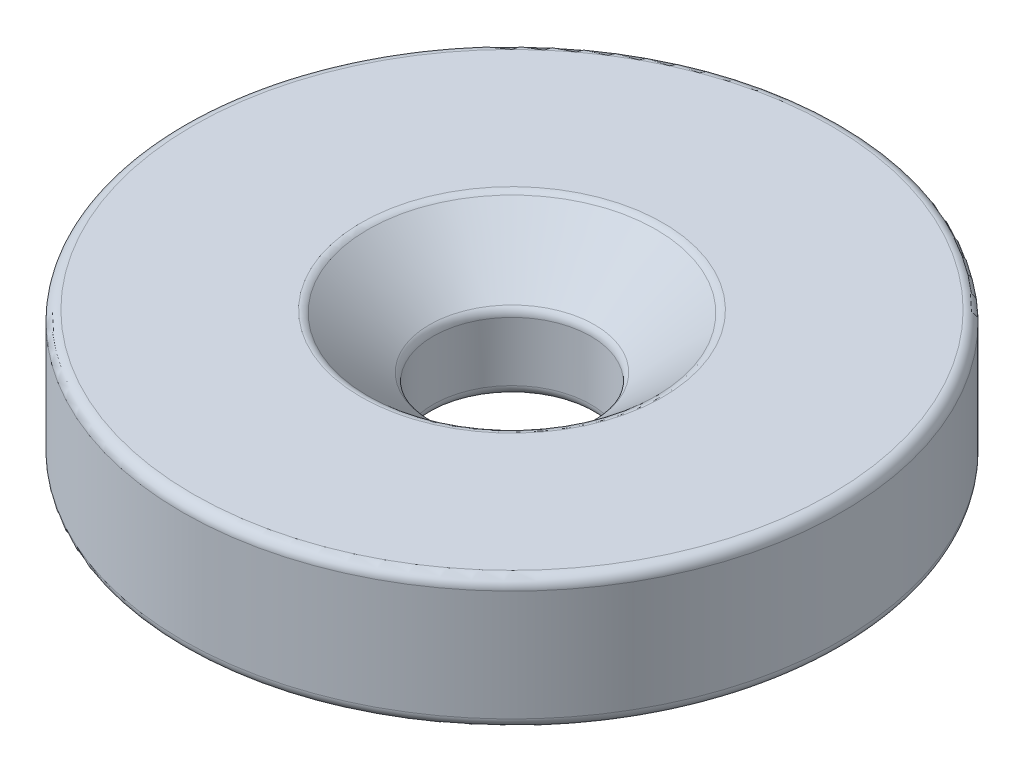
ISO-10303-21;
HEADER;
FILE_DESCRIPTION(('STEP AP214'),'2;1');
FILE_NAME('part.step','',(''),(''),'','','');
FILE_SCHEMA(('AUTOMOTIVE_DESIGN { 1 0 10303 214 1 1 1 1 }'));
ENDSEC;
DATA;
#1=APPLICATION_CONTEXT('core data for automotive mechanical design processes');
#2=APPLICATION_PROTOCOL_DEFINITION('international standard','automotive_design',2000,#1);
#3=PRODUCT_CONTEXT('',#1,'mechanical');
#4=PRODUCT('Part','Part','',(#3));
#5=PRODUCT_RELATED_PRODUCT_CATEGORY('part','',(#4));
#6=PRODUCT_DEFINITION_FORMATION('','',#4);
#7=PRODUCT_DEFINITION_CONTEXT('part definition',#1,'design');
#8=PRODUCT_DEFINITION('design','',#6,#7);
#9=PRODUCT_DEFINITION_SHAPE('','',#8);
#10=(LENGTH_UNIT() NAMED_UNIT(*) SI_UNIT(.MILLI.,.METRE.));
#11=(NAMED_UNIT(*) PLANE_ANGLE_UNIT() SI_UNIT($,.RADIAN.));
#12=(NAMED_UNIT(*) SI_UNIT($,.STERADIAN.) SOLID_ANGLE_UNIT());
#13=UNCERTAINTY_MEASURE_WITH_UNIT(LENGTH_MEASURE(1.E-05),#10,'distance_accuracy_value','');
#14=(GEOMETRIC_REPRESENTATION_CONTEXT(3) GLOBAL_UNCERTAINTY_ASSIGNED_CONTEXT((#13)) GLOBAL_UNIT_ASSIGNED_CONTEXT((#10,
#11,#12)) REPRESENTATION_CONTEXT('',''));
#15=CARTESIAN_POINT('',(0.,0.,0.));
#16=DIRECTION('',(0.,0.,1.));
#17=DIRECTION('',(1.,0.,0.));
#18=AXIS2_PLACEMENT_3D('',#15,#16,#17);
#19=CARTESIAN_POINT('',(0.,1.5875,0.));
#20=DIRECTION('',(0.,-1.,0.));
#21=DIRECTION('',(0.,0.,-1.));
#22=AXIS2_PLACEMENT_3D('',#19,#20,#21);
#23=CYLINDRICAL_SURFACE('',#22,7.9375);
#24=CARTESIAN_POINT('',(0.,-1.3335,0.));
#25=DIRECTION('',(0.,1.,0.));
#26=DIRECTION('',(0.,0.,1.));
#27=AXIS2_PLACEMENT_3D('',#24,#25,#26);
#28=CIRCLE('',#27,7.9375);
#29=CARTESIAN_POINT('',(0.,-1.3335,7.9375));
#30=VERTEX_POINT('',#29);
#31=EDGE_CURVE('E10',#30,#30,#28,.T.);
#32=ORIENTED_EDGE('',*,*,#31,.T.);
#33=EDGE_LOOP('',(#32));
#34=FACE_BOUND('',#33,.T.);
#35=CARTESIAN_POINT('',(0.,1.3335,0.));
#36=DIRECTION('',(0.,1.,0.));
#37=DIRECTION('',(0.,0.,1.));
#38=AXIS2_PLACEMENT_3D('',#35,#36,#37);
#39=CIRCLE('',#38,7.9375);
#40=CARTESIAN_POINT('',(0.,1.3335,7.9375));
#41=VERTEX_POINT('',#40);
#42=EDGE_CURVE('E40',#41,#41,#39,.F.);
#43=ORIENTED_EDGE('',*,*,#42,.T.);
#44=EDGE_LOOP('',(#43));
#45=FACE_BOUND('',#44,.T.);
#46=ADVANCED_FACE('F33',(#34,#45),#23,.T.);
#47=CARTESIAN_POINT('',(0.,1.5875,0.));
#48=DIRECTION('',(0.,1.,0.));
#49=DIRECTION('',(0.,0.,1.));
#50=AXIS2_PLACEMENT_3D('',#47,#48,#49);
#51=PLANE('',#50);
#52=CARTESIAN_POINT('',(0.,1.5875,0.));
#53=DIRECTION('',(0.,1.,0.));
#54=DIRECTION('',(0.,0.,1.));
#55=AXIS2_PLACEMENT_3D('',#52,#53,#54);
#56=CIRCLE('',#55,3.63574843950362);
#57=CARTESIAN_POINT('',(0.,1.5875,3.63574843950362));
#58=VERTEX_POINT('',#57);
#59=EDGE_CURVE('E59',#58,#58,#56,.F.);
#60=ORIENTED_EDGE('',*,*,#59,.T.);
#61=EDGE_LOOP('',(#60));
#62=FACE_BOUND('',#61,.T.);
#63=CARTESIAN_POINT('',(0.,1.5875,0.));
#64=DIRECTION('',(0.,1.,0.));
#65=DIRECTION('',(0.,0.,1.));
#66=AXIS2_PLACEMENT_3D('',#63,#64,#65);
#67=CIRCLE('',#66,7.6835);
#68=CARTESIAN_POINT('',(0.,1.5875,7.6835));
#69=VERTEX_POINT('',#68);
#70=EDGE_CURVE('E62',#69,#69,#67,.T.);
#71=ORIENTED_EDGE('',*,*,#70,.T.);
#72=EDGE_LOOP('',(#71));
#73=FACE_BOUND('',#72,.T.);
#74=ADVANCED_FACE('F97',(#62,#73),#51,.T.);
#75=CARTESIAN_POINT('',(0.,-1.5875,0.));
#76=DIRECTION('',(0.,1.,0.));
#77=DIRECTION('',(0.,0.,1.));
#78=AXIS2_PLACEMENT_3D('',#75,#76,#77);
#79=PLANE('',#78);
#80=CARTESIAN_POINT('',(0.,-1.5875,0.));
#81=DIRECTION('',(0.,1.,0.));
#82=DIRECTION('',(0.,0.,1.));
#83=AXIS2_PLACEMENT_3D('',#80,#81,#82);
#84=CIRCLE('',#83,2.15265);
#85=CARTESIAN_POINT('',(0.,-1.5875,2.15265));
#86=VERTEX_POINT('',#85);
#87=EDGE_CURVE('E44',#86,#86,#84,.T.);
#88=ORIENTED_EDGE('',*,*,#87,.T.);
#89=EDGE_LOOP('',(#88));
#90=FACE_BOUND('',#89,.T.);
#91=CARTESIAN_POINT('',(0.,-1.5875,0.));
#92=DIRECTION('',(0.,1.,0.));
#93=DIRECTION('',(0.,0.,1.));
#94=AXIS2_PLACEMENT_3D('',#91,#92,#93);
#95=CIRCLE('',#94,7.6835);
#96=CARTESIAN_POINT('',(0.,-1.5875,7.6835));
#97=VERTEX_POINT('',#96);
#98=EDGE_CURVE('E48',#97,#97,#95,.F.);
#99=ORIENTED_EDGE('',*,*,#98,.T.);
#100=EDGE_LOOP('',(#99));
#101=FACE_BOUND('',#100,.T.);
#102=ADVANCED_FACE('F85',(#90,#101),#79,.F.);
#103=CARTESIAN_POINT('',(0.,1.5875,0.));
#104=DIRECTION('',(0.,1.,0.));
#105=DIRECTION('',(0.,0.,1.));
#106=AXIS2_PLACEMENT_3D('',#103,#104,#105);
#107=CYLINDRICAL_SURFACE('',#106,1.89865);
#108=CARTESIAN_POINT('',(0.,0.0890326464129164,0.));
#109=DIRECTION('',(0.,-1.,0.));
#110=DIRECTION('',(0.,0.,-1.));
#111=AXIS2_PLACEMENT_3D('',#108,#109,#110);
#112=CIRCLE('',#111,1.89865);
#113=CARTESIAN_POINT('',(0.,0.0890326464129164,-1.89865));
#114=VERTEX_POINT('',#113);
#115=EDGE_CURVE('E53',#114,#114,#112,.F.);
#116=ORIENTED_EDGE('',*,*,#115,.T.);
#117=EDGE_LOOP('',(#116));
#118=FACE_BOUND('',#117,.T.);
#119=CARTESIAN_POINT('',(0.,-1.3335,0.));
#120=DIRECTION('',(0.,1.,0.));
#121=DIRECTION('',(0.,0.,1.));
#122=AXIS2_PLACEMENT_3D('',#119,#120,#121);
#123=CIRCLE('',#122,1.89865);
#124=CARTESIAN_POINT('',(0.,-1.3335,1.89865));
#125=VERTEX_POINT('',#124);
#126=EDGE_CURVE('E56',#125,#125,#123,.F.);
#127=ORIENTED_EDGE('',*,*,#126,.T.);
#128=EDGE_LOOP('',(#127));
#129=FACE_BOUND('',#128,.T.);
#130=ADVANCED_FACE('F82',(#118,#129),#107,.F.);
#131=CARTESIAN_POINT('',(0.,1.5875,0.));
#132=DIRECTION('',(0.,1.,0.));
#133=DIRECTION('',(0.,0.,1.));
#134=AXIS2_PLACEMENT_3D('',#131,#132,#133);
#135=CONICAL_SURFACE('',#134,3.5433,0.872664625997165);
#136=CARTESIAN_POINT('',(0.,1.52807528855222,0.));
#137=DIRECTION('',(0.,1.,0.));
#138=DIRECTION('',(0.,0.,1.));
#139=AXIS2_PLACEMENT_3D('',#136,#137,#138);
#140=CIRCLE('',#139,3.47248038664323);
#141=CARTESIAN_POINT('',(0.,1.52807528855222,3.47248038664323));
#142=VERTEX_POINT('',#141);
#143=EDGE_CURVE('E65',#142,#142,#140,.T.);
#144=ORIENTED_EDGE('',*,*,#143,.T.);
#145=EDGE_LOOP('',(#144));
#146=FACE_BOUND('',#145,.T.);
#147=CARTESIAN_POINT('',(0.,0.283607934965137,0.));
#148=DIRECTION('',(0.,-1.,0.));
#149=DIRECTION('',(0.,0.,-1.));
#150=AXIS2_PLACEMENT_3D('',#147,#148,#149);
#151=CIRCLE('',#150,1.98938194713962);
#152=CARTESIAN_POINT('',(0.,0.283607934965137,-1.98938194713962));
#153=VERTEX_POINT('',#152);
#154=EDGE_CURVE('E68',#153,#153,#151,.T.);
#155=ORIENTED_EDGE('',*,*,#154,.T.);
#156=EDGE_LOOP('',(#155));
#157=FACE_BOUND('',#156,.T.);
#158=ADVANCED_FACE('F72',(#146,#157),#135,.F.);
#159=CARTESIAN_POINT('',(0.,1.3335,0.));
#160=DIRECTION('',(0.,1.,0.));
#161=DIRECTION('',(0.,0.,1.));
#162=AXIS2_PLACEMENT_3D('',#159,#160,#161);
#163=TOROIDAL_SURFACE('',#162,3.63574843950362,0.254);
#164=ORIENTED_EDGE('',*,*,#59,.F.);
#165=EDGE_LOOP('',(#164));
#166=FACE_BOUND('',#165,.T.);
#167=ORIENTED_EDGE('',*,*,#143,.F.);
#168=EDGE_LOOP('',(#167));
#169=FACE_BOUND('',#168,.T.);
#170=ADVANCED_FACE('F78',(#166,#169),#163,.T.);
#171=CARTESIAN_POINT('',(0.,0.0890326464129164,0.));
#172=DIRECTION('',(0.,-1.,0.));
#173=DIRECTION('',(0.,0.,-1.));
#174=AXIS2_PLACEMENT_3D('',#171,#172,#173);
#175=TOROIDAL_SURFACE('',#174,2.15265,0.254);
#176=ORIENTED_EDGE('',*,*,#154,.F.);
#177=EDGE_LOOP('',(#176));
#178=FACE_BOUND('',#177,.T.);
#179=ORIENTED_EDGE('',*,*,#115,.F.);
#180=EDGE_LOOP('',(#179));
#181=FACE_BOUND('',#180,.T.);
#182=ADVANCED_FACE('F74',(#178,#181),#175,.T.);
#183=CARTESIAN_POINT('',(0.,-1.3335,0.));
#184=DIRECTION('',(0.,1.,0.));
#185=DIRECTION('',(0.,0.,1.));
#186=AXIS2_PLACEMENT_3D('',#183,#184,#185);
#187=TOROIDAL_SURFACE('',#186,2.15265,0.254);
#188=ORIENTED_EDGE('',*,*,#126,.F.);
#189=EDGE_LOOP('',(#188));
#190=FACE_BOUND('',#189,.T.);
#191=ORIENTED_EDGE('',*,*,#87,.F.);
#192=EDGE_LOOP('',(#191));
#193=FACE_BOUND('',#192,.T.);
#194=ADVANCED_FACE('F77',(#190,#193),#187,.T.);
#195=CARTESIAN_POINT('',(0.,-1.3335,0.));
#196=DIRECTION('',(0.,1.,0.));
#197=DIRECTION('',(0.,0.,1.));
#198=AXIS2_PLACEMENT_3D('',#195,#196,#197);
#199=TOROIDAL_SURFACE('',#198,7.6835,0.254);
#200=ORIENTED_EDGE('',*,*,#98,.F.);
#201=EDGE_LOOP('',(#200));
#202=FACE_BOUND('',#201,.T.);
#203=ORIENTED_EDGE('',*,*,#31,.F.);
#204=EDGE_LOOP('',(#203));
#205=FACE_BOUND('',#204,.T.);
#206=ADVANCED_FACE('F91',(#202,#205),#199,.T.);
#207=CARTESIAN_POINT('',(0.,1.3335,0.));
#208=DIRECTION('',(0.,1.,0.));
#209=DIRECTION('',(0.,0.,1.));
#210=AXIS2_PLACEMENT_3D('',#207,#208,#209);
#211=TOROIDAL_SURFACE('',#210,7.6835,0.254);
#212=ORIENTED_EDGE('',*,*,#42,.F.);
#213=EDGE_LOOP('',(#212));
#214=FACE_BOUND('',#213,.T.);
#215=ORIENTED_EDGE('',*,*,#70,.F.);
#216=EDGE_LOOP('',(#215));
#217=FACE_BOUND('',#216,.T.);
#218=ADVANCED_FACE('F35',(#214,#217),#211,.T.);
#219=CLOSED_SHELL('',(#46,#74,#102,#130,#158,#170,#182,#194,#206,#218));
#220=MANIFOLD_SOLID_BREP('B2',#219);
#221=ADVANCED_BREP_SHAPE_REPRESENTATION('',(#18,#220),#14);
#222=SHAPE_DEFINITION_REPRESENTATION(#9,#221);
ENDSEC;
END-ISO-10303-21;
